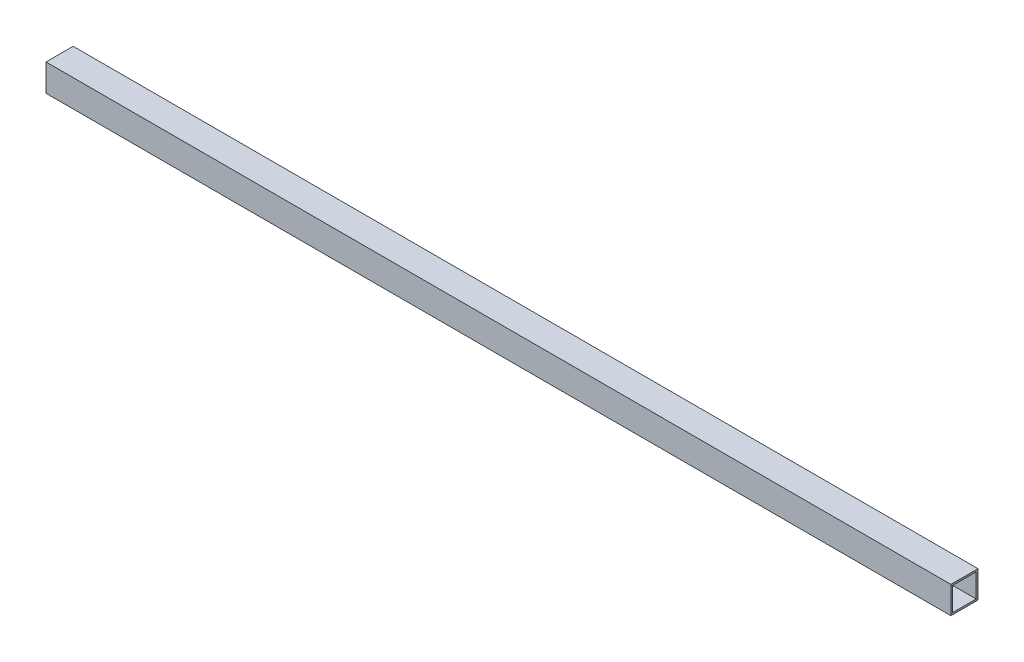
ISO-10303-21;
HEADER;
FILE_DESCRIPTION(('STEP AP214'),'2;1');
FILE_NAME('part.step','',(''),(''),'','','');
FILE_SCHEMA(('AUTOMOTIVE_DESIGN { 1 0 10303 214 1 1 1 1 }'));
ENDSEC;
DATA;
#1=APPLICATION_CONTEXT('core data for automotive mechanical design processes');
#2=APPLICATION_PROTOCOL_DEFINITION('international standard','automotive_design',2000,#1);
#3=PRODUCT_CONTEXT('',#1,'mechanical');
#4=PRODUCT('Part','Part','',(#3));
#5=PRODUCT_RELATED_PRODUCT_CATEGORY('part','',(#4));
#6=PRODUCT_DEFINITION_FORMATION('','',#4);
#7=PRODUCT_DEFINITION_CONTEXT('part definition',#1,'design');
#8=PRODUCT_DEFINITION('design','',#6,#7);
#9=PRODUCT_DEFINITION_SHAPE('','',#8);
#10=(LENGTH_UNIT() NAMED_UNIT(*) SI_UNIT(.MILLI.,.METRE.));
#11=(NAMED_UNIT(*) PLANE_ANGLE_UNIT() SI_UNIT($,.RADIAN.));
#12=(NAMED_UNIT(*) SI_UNIT($,.STERADIAN.) SOLID_ANGLE_UNIT());
#13=UNCERTAINTY_MEASURE_WITH_UNIT(LENGTH_MEASURE(1.E-05),#10,'distance_accuracy_value','');
#14=(GEOMETRIC_REPRESENTATION_CONTEXT(3) GLOBAL_UNCERTAINTY_ASSIGNED_CONTEXT((#13)) GLOBAL_UNIT_ASSIGNED_CONTEXT((#10,
#11,#12)) REPRESENTATION_CONTEXT('',''));
#15=CARTESIAN_POINT('',(0.,0.,0.));
#16=DIRECTION('',(0.,0.,1.));
#17=DIRECTION('',(1.,0.,0.));
#18=AXIS2_PLACEMENT_3D('',#15,#16,#17);
#19=CARTESIAN_POINT('',(500.,0.,0.));
#20=DIRECTION('',(-1.,0.,0.));
#21=DIRECTION('',(0.,0.,1.));
#22=AXIS2_PLACEMENT_3D('',#19,#20,#21);
#23=PLANE('',#22);
#24=DIRECTION('',(0.,1.,0.));
#25=VECTOR('',#24,1.);
#26=CARTESIAN_POINT('',(500.,-7.5,-7.5));
#27=LINE('',#26,#25);
#28=CARTESIAN_POINT('',(500.,-7.5,-7.5));
#29=VERTEX_POINT('',#28);
#30=CARTESIAN_POINT('',(500.,7.5,-7.5));
#31=VERTEX_POINT('',#30);
#32=EDGE_CURVE('E157',#29,#31,#27,.T.);
#33=ORIENTED_EDGE('',*,*,#32,.T.);
#34=DIRECTION('',(0.,0.,1.));
#35=VECTOR('',#34,1.);
#36=CARTESIAN_POINT('',(500.,7.5,7.5));
#37=LINE('',#36,#35);
#38=CARTESIAN_POINT('',(500.,7.5,7.5));
#39=VERTEX_POINT('',#38);
#40=EDGE_CURVE('E161',#31,#39,#37,.T.);
#41=ORIENTED_EDGE('',*,*,#40,.T.);
#42=DIRECTION('',(0.,-1.,0.));
#43=VECTOR('',#42,1.);
#44=CARTESIAN_POINT('',(500.,-7.5,7.5));
#45=LINE('',#44,#43);
#46=CARTESIAN_POINT('',(500.,-7.5,7.5));
#47=VERTEX_POINT('',#46);
#48=EDGE_CURVE('E165',#39,#47,#45,.T.);
#49=ORIENTED_EDGE('',*,*,#48,.T.);
#50=DIRECTION('',(0.,0.,-1.));
#51=VECTOR('',#50,1.);
#52=CARTESIAN_POINT('',(500.,-7.5,7.5));
#53=LINE('',#52,#51);
#54=EDGE_CURVE('E168',#47,#29,#53,.T.);
#55=ORIENTED_EDGE('',*,*,#54,.T.);
#56=EDGE_LOOP('',(#33,#41,#49,#55));
#57=FACE_BOUND('',#56,.T.);
#58=DIRECTION('',(0.,1.,0.));
#59=VECTOR('',#58,1.);
#60=CARTESIAN_POINT('',(500.,-6.5,-6.5));
#61=LINE('',#60,#59);
#62=CARTESIAN_POINT('',(500.,-6.5,-6.5));
#63=VERTEX_POINT('',#62);
#64=CARTESIAN_POINT('',(500.,6.5,-6.5));
#65=VERTEX_POINT('',#64);
#66=EDGE_CURVE('E109',#63,#65,#61,.T.);
#67=ORIENTED_EDGE('',*,*,#66,.F.);
#68=DIRECTION('',(0.,0.,-1.));
#69=VECTOR('',#68,1.);
#70=CARTESIAN_POINT('',(500.,-6.5,6.5));
#71=LINE('',#70,#69);
#72=CARTESIAN_POINT('',(500.,-6.5,6.5));
#73=VERTEX_POINT('',#72);
#74=EDGE_CURVE('E135',#73,#63,#71,.T.);
#75=ORIENTED_EDGE('',*,*,#74,.F.);
#76=DIRECTION('',(0.,-1.,0.));
#77=VECTOR('',#76,1.);
#78=CARTESIAN_POINT('',(500.,-6.5,6.5));
#79=LINE('',#78,#77);
#80=CARTESIAN_POINT('',(500.,6.5,6.5));
#81=VERTEX_POINT('',#80);
#82=EDGE_CURVE('E131',#81,#73,#79,.T.);
#83=ORIENTED_EDGE('',*,*,#82,.F.);
#84=DIRECTION('',(0.,0.,1.));
#85=VECTOR('',#84,1.);
#86=CARTESIAN_POINT('',(500.,6.5,6.5));
#87=LINE('',#86,#85);
#88=EDGE_CURVE('E118',#65,#81,#87,.T.);
#89=ORIENTED_EDGE('',*,*,#88,.F.);
#90=EDGE_LOOP('',(#67,#75,#83,#89));
#91=FACE_BOUND('',#90,.T.);
#92=ADVANCED_FACE('F43',(#57,#91),#23,.F.);
#93=CARTESIAN_POINT('',(0.,0.,0.));
#94=DIRECTION('',(-1.,0.,0.));
#95=DIRECTION('',(0.,0.,1.));
#96=AXIS2_PLACEMENT_3D('',#93,#94,#95);
#97=PLANE('',#96);
#98=DIRECTION('',(0.,1.,0.));
#99=VECTOR('',#98,1.);
#100=CARTESIAN_POINT('',(0.,-7.5,-7.5));
#101=LINE('',#100,#99);
#102=CARTESIAN_POINT('',(0.,-7.5,-7.5));
#103=VERTEX_POINT('',#102);
#104=CARTESIAN_POINT('',(0.,7.5,-7.5));
#105=VERTEX_POINT('',#104);
#106=EDGE_CURVE('E127',#103,#105,#101,.T.);
#107=ORIENTED_EDGE('',*,*,#106,.F.);
#108=DIRECTION('',(0.,0.,-1.));
#109=VECTOR('',#108,1.);
#110=CARTESIAN_POINT('',(0.,-7.5,7.5));
#111=LINE('',#110,#109);
#112=CARTESIAN_POINT('',(0.,-7.5,7.5));
#113=VERTEX_POINT('',#112);
#114=EDGE_CURVE('E162',#113,#103,#111,.T.);
#115=ORIENTED_EDGE('',*,*,#114,.F.);
#116=DIRECTION('',(0.,-1.,0.));
#117=VECTOR('',#116,1.);
#118=CARTESIAN_POINT('',(0.,-7.5,7.5));
#119=LINE('',#118,#117);
#120=CARTESIAN_POINT('',(0.,7.5,7.5));
#121=VERTEX_POINT('',#120);
#122=EDGE_CURVE('E178',#121,#113,#119,.T.);
#123=ORIENTED_EDGE('',*,*,#122,.F.);
#124=DIRECTION('',(0.,0.,1.));
#125=VECTOR('',#124,1.);
#126=CARTESIAN_POINT('',(0.,7.5,7.5));
#127=LINE('',#126,#125);
#128=EDGE_CURVE('E175',#105,#121,#127,.T.);
#129=ORIENTED_EDGE('',*,*,#128,.F.);
#130=EDGE_LOOP('',(#107,#115,#123,#129));
#131=FACE_BOUND('',#130,.T.);
#132=DIRECTION('',(0.,0.,-1.));
#133=VECTOR('',#132,1.);
#134=CARTESIAN_POINT('',(0.,-6.5,6.5));
#135=LINE('',#134,#133);
#136=CARTESIAN_POINT('',(0.,-6.5,6.5));
#137=VERTEX_POINT('',#136);
#138=CARTESIAN_POINT('',(0.,-6.5,-6.5));
#139=VERTEX_POINT('',#138);
#140=EDGE_CURVE('E119',#137,#139,#135,.T.);
#141=ORIENTED_EDGE('',*,*,#140,.T.);
#142=DIRECTION('',(0.,1.,0.));
#143=VECTOR('',#142,1.);
#144=CARTESIAN_POINT('',(0.,-6.5,-6.5));
#145=LINE('',#144,#143);
#146=CARTESIAN_POINT('',(0.,6.5,-6.5));
#147=VERTEX_POINT('',#146);
#148=EDGE_CURVE('E67',#139,#147,#145,.T.);
#149=ORIENTED_EDGE('',*,*,#148,.T.);
#150=DIRECTION('',(0.,0.,1.));
#151=VECTOR('',#150,1.);
#152=CARTESIAN_POINT('',(0.,6.5,6.5));
#153=LINE('',#152,#151);
#154=CARTESIAN_POINT('',(0.,6.5,6.5));
#155=VERTEX_POINT('',#154);
#156=EDGE_CURVE('E125',#147,#155,#153,.T.);
#157=ORIENTED_EDGE('',*,*,#156,.T.);
#158=DIRECTION('',(0.,-1.,0.));
#159=VECTOR('',#158,1.);
#160=CARTESIAN_POINT('',(0.,-6.5,6.5));
#161=LINE('',#160,#159);
#162=EDGE_CURVE('E144',#155,#137,#161,.T.);
#163=ORIENTED_EDGE('',*,*,#162,.T.);
#164=EDGE_LOOP('',(#141,#149,#157,#163));
#165=FACE_BOUND('',#164,.T.);
#166=ADVANCED_FACE('F201',(#131,#165),#97,.T.);
#167=CARTESIAN_POINT('',(500.,-7.5,-7.5));
#168=DIRECTION('',(0.,0.,1.));
#169=DIRECTION('',(1.,0.,0.));
#170=AXIS2_PLACEMENT_3D('',#167,#168,#169);
#171=PLANE('',#170);
#172=ORIENTED_EDGE('',*,*,#106,.T.);
#173=DIRECTION('',(-1.,0.,0.));
#174=VECTOR('',#173,1.);
#175=CARTESIAN_POINT('',(500.,7.5,-7.5));
#176=LINE('',#175,#174);
#177=EDGE_CURVE('E11',#31,#105,#176,.T.);
#178=ORIENTED_EDGE('',*,*,#177,.F.);
#179=ORIENTED_EDGE('',*,*,#32,.F.);
#180=DIRECTION('',(-1.,0.,0.));
#181=VECTOR('',#180,1.);
#182=CARTESIAN_POINT('',(500.,-7.5,-7.5));
#183=LINE('',#182,#181);
#184=EDGE_CURVE('E171',#29,#103,#183,.T.);
#185=ORIENTED_EDGE('',*,*,#184,.T.);
#186=EDGE_LOOP('',(#172,#178,#179,#185));
#187=FACE_BOUND('',#186,.T.);
#188=ADVANCED_FACE('F45',(#187),#171,.F.);
#189=CARTESIAN_POINT('',(500.,7.5,7.5));
#190=DIRECTION('',(0.,-1.,0.));
#191=DIRECTION('',(0.,0.,-1.));
#192=AXIS2_PLACEMENT_3D('',#189,#190,#191);
#193=PLANE('',#192);
#194=ORIENTED_EDGE('',*,*,#128,.T.);
#195=DIRECTION('',(-1.,0.,0.));
#196=VECTOR('',#195,1.);
#197=CARTESIAN_POINT('',(500.,7.5,7.5));
#198=LINE('',#197,#196);
#199=EDGE_CURVE('E52',#39,#121,#198,.T.);
#200=ORIENTED_EDGE('',*,*,#199,.F.);
#201=ORIENTED_EDGE('',*,*,#40,.F.);
#202=ORIENTED_EDGE('',*,*,#177,.T.);
#203=EDGE_LOOP('',(#194,#200,#201,#202));
#204=FACE_BOUND('',#203,.T.);
#205=ADVANCED_FACE('F211',(#204),#193,.F.);
#206=CARTESIAN_POINT('',(500.,-7.5,7.5));
#207=DIRECTION('',(0.,0.,-1.));
#208=DIRECTION('',(-1.,0.,0.));
#209=AXIS2_PLACEMENT_3D('',#206,#207,#208);
#210=PLANE('',#209);
#211=ORIENTED_EDGE('',*,*,#122,.T.);
#212=DIRECTION('',(-1.,0.,0.));
#213=VECTOR('',#212,1.);
#214=CARTESIAN_POINT('',(500.,-7.5,7.5));
#215=LINE('',#214,#213);
#216=EDGE_CURVE('E186',#47,#113,#215,.T.);
#217=ORIENTED_EDGE('',*,*,#216,.F.);
#218=ORIENTED_EDGE('',*,*,#48,.F.);
#219=ORIENTED_EDGE('',*,*,#199,.T.);
#220=EDGE_LOOP('',(#211,#217,#218,#219));
#221=FACE_BOUND('',#220,.T.);
#222=ADVANCED_FACE('F195',(#221),#210,.F.);
#223=CARTESIAN_POINT('',(500.,-7.5,7.5));
#224=DIRECTION('',(0.,1.,0.));
#225=DIRECTION('',(0.,0.,1.));
#226=AXIS2_PLACEMENT_3D('',#223,#224,#225);
#227=PLANE('',#226);
#228=ORIENTED_EDGE('',*,*,#114,.T.);
#229=ORIENTED_EDGE('',*,*,#184,.F.);
#230=ORIENTED_EDGE('',*,*,#54,.F.);
#231=ORIENTED_EDGE('',*,*,#216,.T.);
#232=EDGE_LOOP('',(#228,#229,#230,#231));
#233=FACE_BOUND('',#232,.T.);
#234=ADVANCED_FACE('F205',(#233),#227,.F.);
#235=CARTESIAN_POINT('',(500.,-6.5,-6.5));
#236=DIRECTION('',(0.,0.,1.));
#237=DIRECTION('',(1.,0.,0.));
#238=AXIS2_PLACEMENT_3D('',#235,#236,#237);
#239=PLANE('',#238);
#240=ORIENTED_EDGE('',*,*,#148,.F.);
#241=DIRECTION('',(-1.,0.,0.));
#242=VECTOR('',#241,1.);
#243=CARTESIAN_POINT('',(500.,-6.5,-6.5));
#244=LINE('',#243,#242);
#245=EDGE_CURVE('E113',#63,#139,#244,.T.);
#246=ORIENTED_EDGE('',*,*,#245,.F.);
#247=ORIENTED_EDGE('',*,*,#66,.T.);
#248=DIRECTION('',(-1.,0.,0.));
#249=VECTOR('',#248,1.);
#250=CARTESIAN_POINT('',(500.,6.5,-6.5));
#251=LINE('',#250,#249);
#252=EDGE_CURVE('E112',#65,#147,#251,.T.);
#253=ORIENTED_EDGE('',*,*,#252,.T.);
#254=EDGE_LOOP('',(#240,#246,#247,#253));
#255=FACE_BOUND('',#254,.T.);
#256=ADVANCED_FACE('F111',(#255),#239,.T.);
#257=CARTESIAN_POINT('',(500.,6.5,6.5));
#258=DIRECTION('',(0.,-1.,0.));
#259=DIRECTION('',(0.,0.,-1.));
#260=AXIS2_PLACEMENT_3D('',#257,#258,#259);
#261=PLANE('',#260);
#262=ORIENTED_EDGE('',*,*,#156,.F.);
#263=ORIENTED_EDGE('',*,*,#252,.F.);
#264=ORIENTED_EDGE('',*,*,#88,.T.);
#265=DIRECTION('',(-1.,0.,0.));
#266=VECTOR('',#265,1.);
#267=CARTESIAN_POINT('',(500.,6.5,6.5));
#268=LINE('',#267,#266);
#269=EDGE_CURVE('E128',#81,#155,#268,.T.);
#270=ORIENTED_EDGE('',*,*,#269,.T.);
#271=EDGE_LOOP('',(#262,#263,#264,#270));
#272=FACE_BOUND('',#271,.T.);
#273=ADVANCED_FACE('F122',(#272),#261,.T.);
#274=CARTESIAN_POINT('',(500.,-6.5,6.5));
#275=DIRECTION('',(0.,0.,-1.));
#276=DIRECTION('',(-1.,0.,0.));
#277=AXIS2_PLACEMENT_3D('',#274,#275,#276);
#278=PLANE('',#277);
#279=ORIENTED_EDGE('',*,*,#162,.F.);
#280=ORIENTED_EDGE('',*,*,#269,.F.);
#281=ORIENTED_EDGE('',*,*,#82,.T.);
#282=DIRECTION('',(-1.,0.,0.));
#283=VECTOR('',#282,1.);
#284=CARTESIAN_POINT('',(500.,-6.5,6.5));
#285=LINE('',#284,#283);
#286=EDGE_CURVE('E59',#73,#137,#285,.T.);
#287=ORIENTED_EDGE('',*,*,#286,.T.);
#288=EDGE_LOOP('',(#279,#280,#281,#287));
#289=FACE_BOUND('',#288,.T.);
#290=ADVANCED_FACE('F234',(#289),#278,.T.);
#291=CARTESIAN_POINT('',(500.,-6.5,6.5));
#292=DIRECTION('',(0.,1.,0.));
#293=DIRECTION('',(0.,0.,1.));
#294=AXIS2_PLACEMENT_3D('',#291,#292,#293);
#295=PLANE('',#294);
#296=ORIENTED_EDGE('',*,*,#140,.F.);
#297=ORIENTED_EDGE('',*,*,#286,.F.);
#298=ORIENTED_EDGE('',*,*,#74,.T.);
#299=ORIENTED_EDGE('',*,*,#245,.T.);
#300=EDGE_LOOP('',(#296,#297,#298,#299));
#301=FACE_BOUND('',#300,.T.);
#302=ADVANCED_FACE('F238',(#301),#295,.T.);
#303=CLOSED_SHELL('',(#92,#166,#188,#205,#222,#234,#256,#273,#290,#302));
#304=MANIFOLD_SOLID_BREP('B2',#303);
#305=ADVANCED_BREP_SHAPE_REPRESENTATION('',(#18,#304),#14);
#306=SHAPE_DEFINITION_REPRESENTATION(#9,#305);
ENDSEC;
END-ISO-10303-21;
